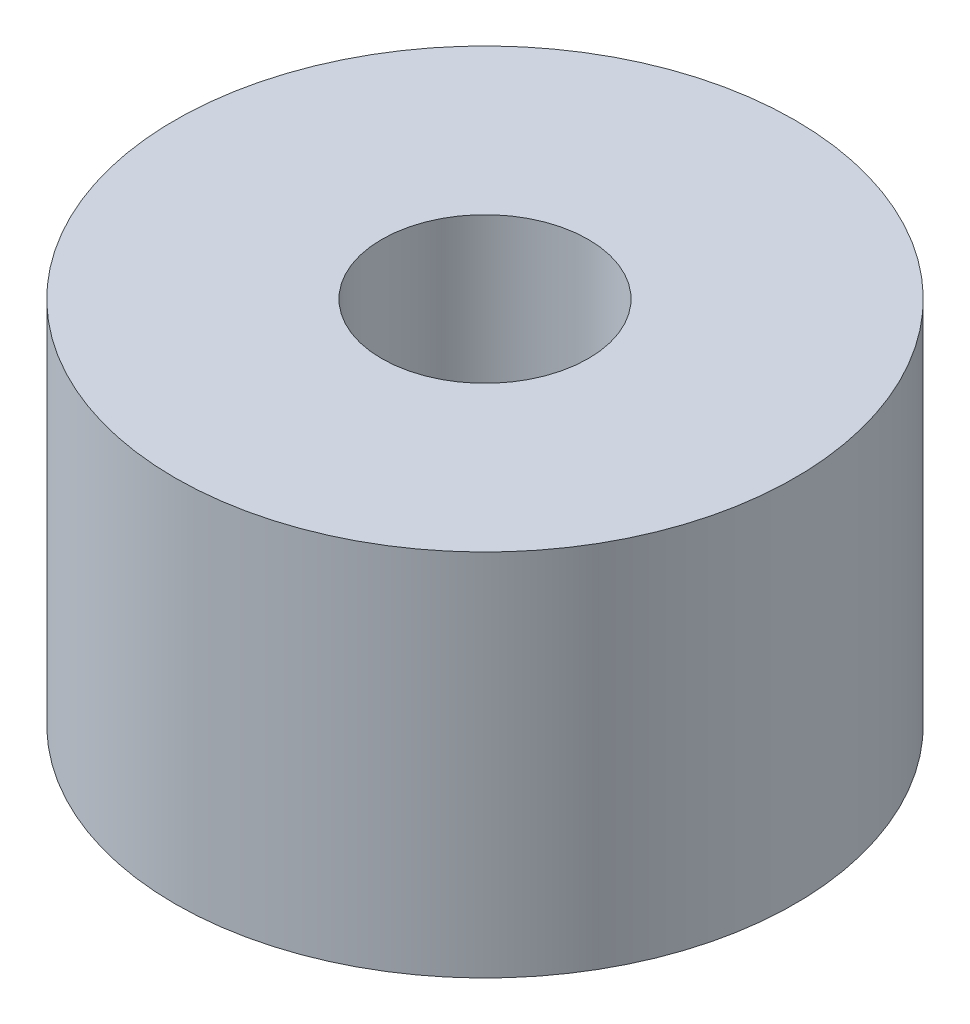
ISO-10303-21;
HEADER;
FILE_DESCRIPTION(('STEP AP214'),'2;1');
FILE_NAME('part.step','',(''),(''),'','','');
FILE_SCHEMA(('AUTOMOTIVE_DESIGN { 1 0 10303 214 1 1 1 1 }'));
ENDSEC;
DATA;
#1=APPLICATION_CONTEXT('core data for automotive mechanical design processes');
#2=APPLICATION_PROTOCOL_DEFINITION('international standard','automotive_design',2000,#1);
#3=PRODUCT_CONTEXT('',#1,'mechanical');
#4=PRODUCT('Part','Part','',(#3));
#5=PRODUCT_RELATED_PRODUCT_CATEGORY('part','',(#4));
#6=PRODUCT_DEFINITION_FORMATION('','',#4);
#7=PRODUCT_DEFINITION_CONTEXT('part definition',#1,'design');
#8=PRODUCT_DEFINITION('design','',#6,#7);
#9=PRODUCT_DEFINITION_SHAPE('','',#8);
#10=(LENGTH_UNIT() NAMED_UNIT(*) SI_UNIT(.MILLI.,.METRE.));
#11=(NAMED_UNIT(*) PLANE_ANGLE_UNIT() SI_UNIT($,.RADIAN.));
#12=(NAMED_UNIT(*) SI_UNIT($,.STERADIAN.) SOLID_ANGLE_UNIT());
#13=UNCERTAINTY_MEASURE_WITH_UNIT(LENGTH_MEASURE(1.E-05),#10,'distance_accuracy_value','');
#14=(GEOMETRIC_REPRESENTATION_CONTEXT(3) GLOBAL_UNCERTAINTY_ASSIGNED_CONTEXT((#13)) GLOBAL_UNIT_ASSIGNED_CONTEXT((#10,
#11,#12)) REPRESENTATION_CONTEXT('',''));
#15=CARTESIAN_POINT('',(0.,0.,0.));
#16=DIRECTION('',(0.,0.,1.));
#17=DIRECTION('',(1.,0.,0.));
#18=AXIS2_PLACEMENT_3D('',#15,#16,#17);
#19=CARTESIAN_POINT('',(2.,-13.,0.));
#20=DIRECTION('',(0.,-1.,0.));
#21=DIRECTION('',(0.,0.,-1.));
#22=AXIS2_PLACEMENT_3D('',#19,#20,#21);
#23=CYLINDRICAL_SURFACE('',#22,7.);
#24=CARTESIAN_POINT('',(2.,-8.,0.));
#25=DIRECTION('',(0.,-1.,0.));
#26=DIRECTION('',(0.,0.,-1.));
#27=AXIS2_PLACEMENT_3D('',#24,#25,#26);
#28=CIRCLE('',#27,7.);
#29=CARTESIAN_POINT('',(2.,-8.,-7.));
#30=VERTEX_POINT('',#29);
#31=EDGE_CURVE('E52',#30,#30,#28,.T.);
#32=ORIENTED_EDGE('',*,*,#31,.T.);
#33=EDGE_LOOP('',(#32));
#34=FACE_BOUND('',#33,.T.);
#35=CARTESIAN_POINT('',(2.,17.,0.));
#36=DIRECTION('',(0.,-1.,0.));
#37=DIRECTION('',(0.,0.,-1.));
#38=AXIS2_PLACEMENT_3D('',#35,#36,#37);
#39=CIRCLE('',#38,7.);
#40=CARTESIAN_POINT('',(2.,17.,-7.));
#41=VERTEX_POINT('',#40);
#42=EDGE_CURVE('E10',#41,#41,#39,.T.);
#43=ORIENTED_EDGE('',*,*,#42,.F.);
#44=EDGE_LOOP('',(#43));
#45=FACE_BOUND('',#44,.T.);
#46=ADVANCED_FACE('F39',(#34,#45),#23,.F.);
#47=CARTESIAN_POINT('',(9.,17.,0.));
#48=DIRECTION('',(0.,1.,0.));
#49=DIRECTION('',(0.,0.,1.));
#50=AXIS2_PLACEMENT_3D('',#47,#48,#49);
#51=PLANE('',#50);
#52=ORIENTED_EDGE('',*,*,#42,.T.);
#53=EDGE_LOOP('',(#52));
#54=FACE_BOUND('',#53,.T.);
#55=CARTESIAN_POINT('',(2.,17.,0.));
#56=DIRECTION('',(0.,-1.,0.));
#57=DIRECTION('',(0.,0.,-1.));
#58=AXIS2_PLACEMENT_3D('',#55,#56,#57);
#59=CIRCLE('',#58,21.);
#60=CARTESIAN_POINT('',(2.,17.,-21.));
#61=VERTEX_POINT('',#60);
#62=EDGE_CURVE('E44',#61,#61,#59,.T.);
#63=ORIENTED_EDGE('',*,*,#62,.F.);
#64=EDGE_LOOP('',(#63));
#65=FACE_BOUND('',#64,.T.);
#66=ADVANCED_FACE('F69',(#54,#65),#51,.T.);
#67=CARTESIAN_POINT('',(2.,-13.,0.));
#68=DIRECTION('',(0.,-1.,0.));
#69=DIRECTION('',(0.,0.,-1.));
#70=AXIS2_PLACEMENT_3D('',#67,#68,#69);
#71=CYLINDRICAL_SURFACE('',#70,21.);
#72=ORIENTED_EDGE('',*,*,#62,.T.);
#73=EDGE_LOOP('',(#72));
#74=FACE_BOUND('',#73,.T.);
#75=CARTESIAN_POINT('',(2.,-8.,0.));
#76=DIRECTION('',(0.,-1.,0.));
#77=DIRECTION('',(0.,0.,-1.));
#78=AXIS2_PLACEMENT_3D('',#75,#76,#77);
#79=CIRCLE('',#78,21.);
#80=CARTESIAN_POINT('',(2.,-8.,-21.));
#81=VERTEX_POINT('',#80);
#82=EDGE_CURVE('E47',#81,#81,#79,.T.);
#83=ORIENTED_EDGE('',*,*,#82,.F.);
#84=EDGE_LOOP('',(#83));
#85=FACE_BOUND('',#84,.T.);
#86=ADVANCED_FACE('F65',(#74,#85),#71,.T.);
#87=CARTESIAN_POINT('',(9.,-8.,0.));
#88=DIRECTION('',(0.,-1.,0.));
#89=DIRECTION('',(0.,0.,-1.));
#90=AXIS2_PLACEMENT_3D('',#87,#88,#89);
#91=PLANE('',#90);
#92=ORIENTED_EDGE('',*,*,#82,.T.);
#93=EDGE_LOOP('',(#92));
#94=FACE_BOUND('',#93,.T.);
#95=ORIENTED_EDGE('',*,*,#31,.F.);
#96=EDGE_LOOP('',(#95));
#97=FACE_BOUND('',#96,.T.);
#98=ADVANCED_FACE('F62',(#94,#97),#91,.T.);
#99=CLOSED_SHELL('',(#46,#66,#86,#98));
#100=MANIFOLD_SOLID_BREP('B2',#99);
#101=ADVANCED_BREP_SHAPE_REPRESENTATION('',(#18,#100),#14);
#102=SHAPE_DEFINITION_REPRESENTATION(#9,#101);
ENDSEC;
END-ISO-10303-21;
